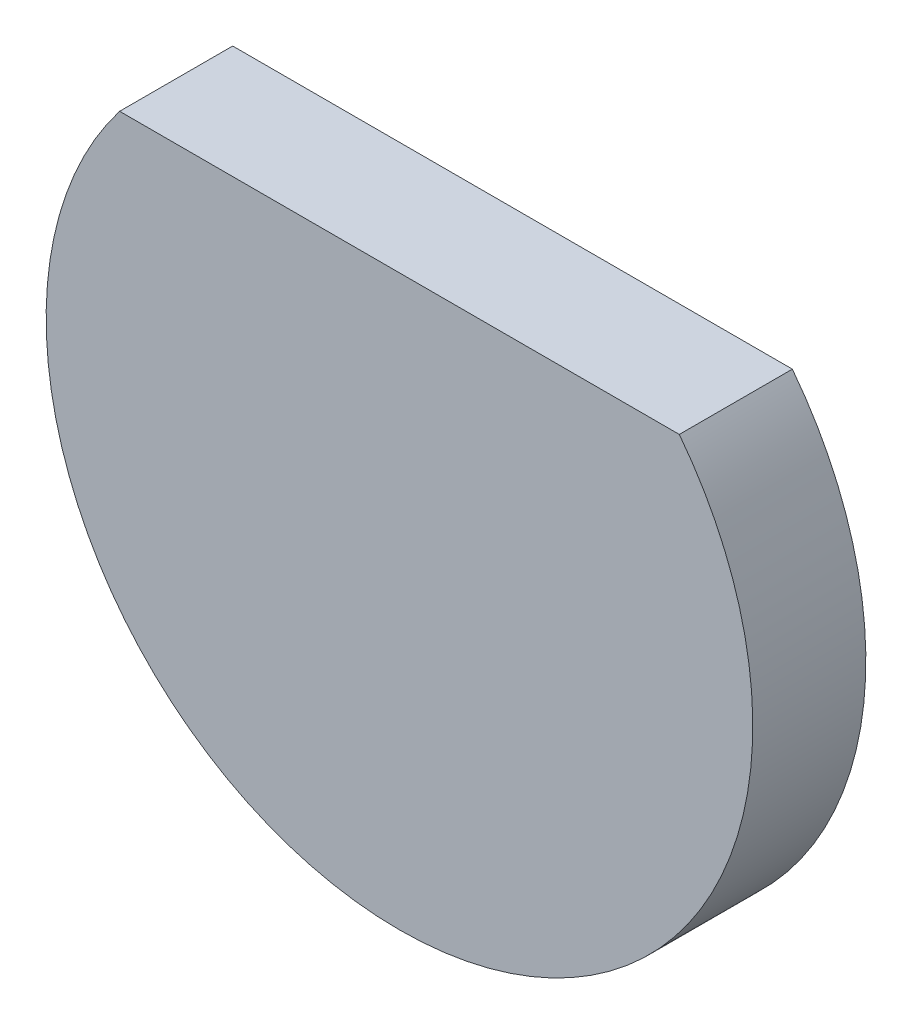
ISO-10303-21;
HEADER;
FILE_DESCRIPTION(('STEP AP214'),'2;1');
FILE_NAME('part.step','',(''),(''),'','','');
FILE_SCHEMA(('AUTOMOTIVE_DESIGN { 1 0 10303 214 1 1 1 1 }'));
ENDSEC;
DATA;
#1=APPLICATION_CONTEXT('core data for automotive mechanical design processes');
#2=APPLICATION_PROTOCOL_DEFINITION('international standard','automotive_design',2000,#1);
#3=PRODUCT_CONTEXT('',#1,'mechanical');
#4=PRODUCT('Part','Part','',(#3));
#5=PRODUCT_RELATED_PRODUCT_CATEGORY('part','',(#4));
#6=PRODUCT_DEFINITION_FORMATION('','',#4);
#7=PRODUCT_DEFINITION_CONTEXT('part definition',#1,'design');
#8=PRODUCT_DEFINITION('design','',#6,#7);
#9=PRODUCT_DEFINITION_SHAPE('','',#8);
#10=(LENGTH_UNIT() NAMED_UNIT(*) SI_UNIT(.MILLI.,.METRE.));
#11=(NAMED_UNIT(*) PLANE_ANGLE_UNIT() SI_UNIT($,.RADIAN.));
#12=(NAMED_UNIT(*) SI_UNIT($,.STERADIAN.) SOLID_ANGLE_UNIT());
#13=UNCERTAINTY_MEASURE_WITH_UNIT(LENGTH_MEASURE(1.E-05),#10,'distance_accuracy_value','');
#14=(GEOMETRIC_REPRESENTATION_CONTEXT(3) GLOBAL_UNCERTAINTY_ASSIGNED_CONTEXT((#13)) GLOBAL_UNIT_ASSIGNED_CONTEXT((#10,
#11,#12)) REPRESENTATION_CONTEXT('',''));
#15=CARTESIAN_POINT('',(0.,0.,0.));
#16=DIRECTION('',(0.,0.,1.));
#17=DIRECTION('',(1.,0.,0.));
#18=AXIS2_PLACEMENT_3D('',#15,#16,#17);
#19=CARTESIAN_POINT('',(0.,0.,20.));
#20=DIRECTION('',(0.,0.,-1.));
#21=DIRECTION('',(-1.,0.,0.));
#22=AXIS2_PLACEMENT_3D('',#19,#20,#21);
#23=CYLINDRICAL_SURFACE('',#22,62.5);
#24=CARTESIAN_POINT('',(0.,0.,0.));
#25=DIRECTION('',(0.,0.,1.));
#26=DIRECTION('',(1.,0.,0.));
#27=AXIS2_PLACEMENT_3D('',#24,#25,#26);
#28=CIRCLE('',#27,62.5);
#29=CARTESIAN_POINT('',(-49.5,38.1575680566778,0.));
#30=VERTEX_POINT('',#29);
#31=CARTESIAN_POINT('',(49.5,38.1575680566778,0.));
#32=VERTEX_POINT('',#31);
#33=EDGE_CURVE('E70',#30,#32,#28,.T.);
#34=ORIENTED_EDGE('',*,*,#33,.T.);
#35=DIRECTION('',(0.,0.,-1.));
#36=VECTOR('',#35,1.);
#37=CARTESIAN_POINT('',(49.5,38.1575680566778,20.));
#38=LINE('',#37,#36);
#39=CARTESIAN_POINT('',(49.5,38.1575680566778,20.));
#40=VERTEX_POINT('',#39);
#41=EDGE_CURVE('E11',#40,#32,#38,.T.);
#42=ORIENTED_EDGE('',*,*,#41,.F.);
#43=CARTESIAN_POINT('',(0.,0.,20.));
#44=DIRECTION('',(0.,0.,1.));
#45=DIRECTION('',(1.,0.,0.));
#46=AXIS2_PLACEMENT_3D('',#43,#44,#45);
#47=CIRCLE('',#46,62.5);
#48=CARTESIAN_POINT('',(-49.5,38.1575680566778,20.));
#49=VERTEX_POINT('',#48);
#50=EDGE_CURVE('E69',#49,#40,#47,.T.);
#51=ORIENTED_EDGE('',*,*,#50,.F.);
#52=DIRECTION('',(0.,0.,-1.));
#53=VECTOR('',#52,1.);
#54=CARTESIAN_POINT('',(-49.5,38.1575680566778,20.));
#55=LINE('',#54,#53);
#56=EDGE_CURVE('E47',#49,#30,#55,.T.);
#57=ORIENTED_EDGE('',*,*,#56,.T.);
#58=EDGE_LOOP('',(#34,#42,#51,#57));
#59=FACE_BOUND('',#58,.T.);
#60=ADVANCED_FACE('F39',(#59),#23,.T.);
#61=CARTESIAN_POINT('',(-49.5,38.1575680566778,20.));
#62=DIRECTION('',(0.,-1.,0.));
#63=DIRECTION('',(0.,0.,-1.));
#64=AXIS2_PLACEMENT_3D('',#61,#62,#63);
#65=PLANE('',#64);
#66=DIRECTION('',(-1.,0.,0.));
#67=VECTOR('',#66,1.);
#68=CARTESIAN_POINT('',(-49.5,38.1575680566778,0.));
#69=LINE('',#68,#67);
#70=EDGE_CURVE('E62',#32,#30,#69,.T.);
#71=ORIENTED_EDGE('',*,*,#70,.T.);
#72=ORIENTED_EDGE('',*,*,#56,.F.);
#73=DIRECTION('',(-1.,0.,0.));
#74=VECTOR('',#73,1.);
#75=CARTESIAN_POINT('',(-49.5,38.1575680566778,20.));
#76=LINE('',#75,#74);
#77=EDGE_CURVE('E54',#40,#49,#76,.T.);
#78=ORIENTED_EDGE('',*,*,#77,.F.);
#79=ORIENTED_EDGE('',*,*,#41,.T.);
#80=EDGE_LOOP('',(#71,#72,#78,#79));
#81=FACE_BOUND('',#80,.T.);
#82=ADVANCED_FACE('F65',(#81),#65,.F.);
#83=CARTESIAN_POINT('',(0.,0.,20.));
#84=DIRECTION('',(0.,0.,1.));
#85=DIRECTION('',(1.,0.,0.));
#86=AXIS2_PLACEMENT_3D('',#83,#84,#85);
#87=PLANE('',#86);
#88=ORIENTED_EDGE('',*,*,#50,.T.);
#89=ORIENTED_EDGE('',*,*,#77,.T.);
#90=EDGE_LOOP('',(#88,#89));
#91=FACE_BOUND('',#90,.T.);
#92=ADVANCED_FACE('F77',(#91),#87,.T.);
#93=CARTESIAN_POINT('',(0.,0.,0.));
#94=DIRECTION('',(0.,0.,1.));
#95=DIRECTION('',(1.,0.,0.));
#96=AXIS2_PLACEMENT_3D('',#93,#94,#95);
#97=PLANE('',#96);
#98=ORIENTED_EDGE('',*,*,#33,.F.);
#99=ORIENTED_EDGE('',*,*,#70,.F.);
#100=EDGE_LOOP('',(#98,#99));
#101=FACE_BOUND('',#100,.T.);
#102=ADVANCED_FACE('F73',(#101),#97,.F.);
#103=CLOSED_SHELL('',(#60,#82,#92,#102));
#104=MANIFOLD_SOLID_BREP('B2',#103);
#105=ADVANCED_BREP_SHAPE_REPRESENTATION('',(#18,#104),#14);
#106=SHAPE_DEFINITION_REPRESENTATION(#9,#105);
ENDSEC;
END-ISO-10303-21;
